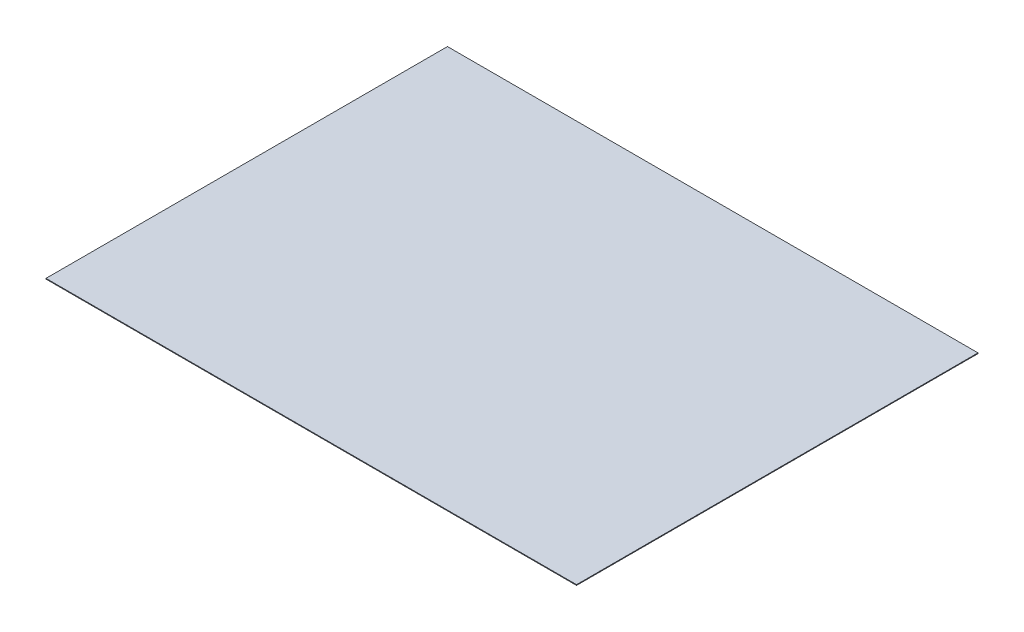
ISO-10303-21;
HEADER;
FILE_DESCRIPTION(('STEP AP214'),'2;1');
FILE_NAME('part.step','',(''),(''),'','','');
FILE_SCHEMA(('AUTOMOTIVE_DESIGN { 1 0 10303 214 1 1 1 1 }'));
ENDSEC;
DATA;
#1=APPLICATION_CONTEXT('core data for automotive mechanical design processes');
#2=APPLICATION_PROTOCOL_DEFINITION('international standard','automotive_design',2000,#1);
#3=PRODUCT_CONTEXT('',#1,'mechanical');
#4=PRODUCT('Part','Part','',(#3));
#5=PRODUCT_RELATED_PRODUCT_CATEGORY('part','',(#4));
#6=PRODUCT_DEFINITION_FORMATION('','',#4);
#7=PRODUCT_DEFINITION_CONTEXT('part definition',#1,'design');
#8=PRODUCT_DEFINITION('design','',#6,#7);
#9=PRODUCT_DEFINITION_SHAPE('','',#8);
#10=(LENGTH_UNIT() NAMED_UNIT(*) SI_UNIT(.MILLI.,.METRE.));
#11=(NAMED_UNIT(*) PLANE_ANGLE_UNIT() SI_UNIT($,.RADIAN.));
#12=(NAMED_UNIT(*) SI_UNIT($,.STERADIAN.) SOLID_ANGLE_UNIT());
#13=UNCERTAINTY_MEASURE_WITH_UNIT(LENGTH_MEASURE(1.E-05),#10,'distance_accuracy_value','');
#14=(GEOMETRIC_REPRESENTATION_CONTEXT(3) GLOBAL_UNCERTAINTY_ASSIGNED_CONTEXT((#13)) GLOBAL_UNIT_ASSIGNED_CONTEXT((#10,
#11,#12)) REPRESENTATION_CONTEXT('',''));
#15=CARTESIAN_POINT('',(0.,0.,0.));
#16=DIRECTION('',(0.,0.,1.));
#17=DIRECTION('',(1.,0.,0.));
#18=AXIS2_PLACEMENT_3D('',#15,#16,#17);
#19=CARTESIAN_POINT('',(-766.5,2.,580.));
#20=DIRECTION('',(1.,0.,0.));
#21=DIRECTION('',(0.,0.,-1.));
#22=AXIS2_PLACEMENT_3D('',#19,#20,#21);
#23=PLANE('',#22);
#24=DIRECTION('',(0.,0.,1.));
#25=VECTOR('',#24,1.);
#26=CARTESIAN_POINT('',(-766.5,0.,580.));
#27=LINE('',#26,#25);
#28=CARTESIAN_POINT('',(-766.5,0.,-580.));
#29=VERTEX_POINT('',#28);
#30=CARTESIAN_POINT('',(-766.5,0.,580.));
#31=VERTEX_POINT('',#30);
#32=EDGE_CURVE('E94',#29,#31,#27,.T.);
#33=ORIENTED_EDGE('',*,*,#32,.T.);
#34=DIRECTION('',(0.,-1.,0.));
#35=VECTOR('',#34,1.);
#36=CARTESIAN_POINT('',(-766.5,2.,580.));
#37=LINE('',#36,#35);
#38=CARTESIAN_POINT('',(-766.5,2.,580.));
#39=VERTEX_POINT('',#38);
#40=EDGE_CURVE('E11',#39,#31,#37,.T.);
#41=ORIENTED_EDGE('',*,*,#40,.F.);
#42=DIRECTION('',(0.,0.,1.));
#43=VECTOR('',#42,1.);
#44=CARTESIAN_POINT('',(-766.5,2.,580.));
#45=LINE('',#44,#43);
#46=CARTESIAN_POINT('',(-766.5,2.,-580.));
#47=VERTEX_POINT('',#46);
#48=EDGE_CURVE('E82',#47,#39,#45,.T.);
#49=ORIENTED_EDGE('',*,*,#48,.F.);
#50=DIRECTION('',(0.,-1.,0.));
#51=VECTOR('',#50,1.);
#52=CARTESIAN_POINT('',(-766.5,2.,-580.));
#53=LINE('',#52,#51);
#54=EDGE_CURVE('E90',#47,#29,#53,.T.);
#55=ORIENTED_EDGE('',*,*,#54,.T.);
#56=EDGE_LOOP('',(#33,#41,#49,#55));
#57=FACE_BOUND('',#56,.T.);
#58=ADVANCED_FACE('F31',(#57),#23,.F.);
#59=CARTESIAN_POINT('',(766.5,2.,580.));
#60=DIRECTION('',(0.,0.,-1.));
#61=DIRECTION('',(-1.,0.,0.));
#62=AXIS2_PLACEMENT_3D('',#59,#60,#61);
#63=PLANE('',#62);
#64=DIRECTION('',(1.,0.,0.));
#65=VECTOR('',#64,1.);
#66=CARTESIAN_POINT('',(766.5,0.,580.));
#67=LINE('',#66,#65);
#68=CARTESIAN_POINT('',(766.5,0.,580.));
#69=VERTEX_POINT('',#68);
#70=EDGE_CURVE('E86',#31,#69,#67,.T.);
#71=ORIENTED_EDGE('',*,*,#70,.T.);
#72=DIRECTION('',(0.,-1.,0.));
#73=VECTOR('',#72,1.);
#74=CARTESIAN_POINT('',(766.5,2.,580.));
#75=LINE('',#74,#73);
#76=CARTESIAN_POINT('',(766.5,2.,580.));
#77=VERTEX_POINT('',#76);
#78=EDGE_CURVE('E39',#77,#69,#75,.T.);
#79=ORIENTED_EDGE('',*,*,#78,.F.);
#80=DIRECTION('',(1.,0.,0.));
#81=VECTOR('',#80,1.);
#82=CARTESIAN_POINT('',(766.5,2.,580.));
#83=LINE('',#82,#81);
#84=EDGE_CURVE('E77',#39,#77,#83,.T.);
#85=ORIENTED_EDGE('',*,*,#84,.F.);
#86=ORIENTED_EDGE('',*,*,#40,.T.);
#87=EDGE_LOOP('',(#71,#79,#85,#86));
#88=FACE_BOUND('',#87,.T.);
#89=ADVANCED_FACE('F85',(#88),#63,.F.);
#90=CARTESIAN_POINT('',(766.5,2.,580.));
#91=DIRECTION('',(-1.,0.,0.));
#92=DIRECTION('',(0.,0.,1.));
#93=AXIS2_PLACEMENT_3D('',#90,#91,#92);
#94=PLANE('',#93);
#95=DIRECTION('',(0.,0.,-1.));
#96=VECTOR('',#95,1.);
#97=CARTESIAN_POINT('',(766.5,0.,580.));
#98=LINE('',#97,#96);
#99=CARTESIAN_POINT('',(766.5,0.,-580.));
#100=VERTEX_POINT('',#99);
#101=EDGE_CURVE('E64',#69,#100,#98,.T.);
#102=ORIENTED_EDGE('',*,*,#101,.T.);
#103=DIRECTION('',(0.,-1.,0.));
#104=VECTOR('',#103,1.);
#105=CARTESIAN_POINT('',(766.5,2.,-580.));
#106=LINE('',#105,#104);
#107=CARTESIAN_POINT('',(766.5,2.,-580.));
#108=VERTEX_POINT('',#107);
#109=EDGE_CURVE('E87',#108,#100,#106,.T.);
#110=ORIENTED_EDGE('',*,*,#109,.F.);
#111=DIRECTION('',(0.,0.,-1.));
#112=VECTOR('',#111,1.);
#113=CARTESIAN_POINT('',(766.5,2.,580.));
#114=LINE('',#113,#112);
#115=EDGE_CURVE('E80',#77,#108,#114,.T.);
#116=ORIENTED_EDGE('',*,*,#115,.F.);
#117=ORIENTED_EDGE('',*,*,#78,.T.);
#118=EDGE_LOOP('',(#102,#110,#116,#117));
#119=FACE_BOUND('',#118,.T.);
#120=ADVANCED_FACE('F88',(#119),#94,.F.);
#121=CARTESIAN_POINT('',(766.5,2.,-580.));
#122=DIRECTION('',(0.,0.,1.));
#123=DIRECTION('',(1.,0.,0.));
#124=AXIS2_PLACEMENT_3D('',#121,#122,#123);
#125=PLANE('',#124);
#126=DIRECTION('',(-1.,0.,0.));
#127=VECTOR('',#126,1.);
#128=CARTESIAN_POINT('',(766.5,0.,-580.));
#129=LINE('',#128,#127);
#130=EDGE_CURVE('E70',#100,#29,#129,.T.);
#131=ORIENTED_EDGE('',*,*,#130,.T.);
#132=ORIENTED_EDGE('',*,*,#54,.F.);
#133=DIRECTION('',(-1.,0.,0.));
#134=VECTOR('',#133,1.);
#135=CARTESIAN_POINT('',(766.5,2.,-580.));
#136=LINE('',#135,#134);
#137=EDGE_CURVE('E47',#108,#47,#136,.T.);
#138=ORIENTED_EDGE('',*,*,#137,.F.);
#139=ORIENTED_EDGE('',*,*,#109,.T.);
#140=EDGE_LOOP('',(#131,#132,#138,#139));
#141=FACE_BOUND('',#140,.T.);
#142=ADVANCED_FACE('F101',(#141),#125,.F.);
#143=CARTESIAN_POINT('',(-766.5,2.,-580.));
#144=DIRECTION('',(0.,1.,0.));
#145=DIRECTION('',(0.,0.,1.));
#146=AXIS2_PLACEMENT_3D('',#143,#144,#145);
#147=PLANE('',#146);
#148=ORIENTED_EDGE('',*,*,#48,.T.);
#149=ORIENTED_EDGE('',*,*,#84,.T.);
#150=ORIENTED_EDGE('',*,*,#115,.T.);
#151=ORIENTED_EDGE('',*,*,#137,.T.);
#152=EDGE_LOOP('',(#148,#149,#150,#151));
#153=FACE_BOUND('',#152,.T.);
#154=ADVANCED_FACE('F78',(#153),#147,.T.);
#155=CARTESIAN_POINT('',(-766.5,0.,-580.));
#156=DIRECTION('',(0.,1.,0.));
#157=DIRECTION('',(0.,0.,1.));
#158=AXIS2_PLACEMENT_3D('',#155,#156,#157);
#159=PLANE('',#158);
#160=ORIENTED_EDGE('',*,*,#32,.F.);
#161=ORIENTED_EDGE('',*,*,#130,.F.);
#162=ORIENTED_EDGE('',*,*,#101,.F.);
#163=ORIENTED_EDGE('',*,*,#70,.F.);
#164=EDGE_LOOP('',(#160,#161,#162,#163));
#165=FACE_BOUND('',#164,.T.);
#166=ADVANCED_FACE('F104',(#165),#159,.F.);
#167=CLOSED_SHELL('',(#58,#89,#120,#142,#154,#166));
#168=MANIFOLD_SOLID_BREP('B2',#167);
#169=ADVANCED_BREP_SHAPE_REPRESENTATION('',(#18,#168),#14);
#170=SHAPE_DEFINITION_REPRESENTATION(#9,#169);
ENDSEC;
END-ISO-10303-21;
